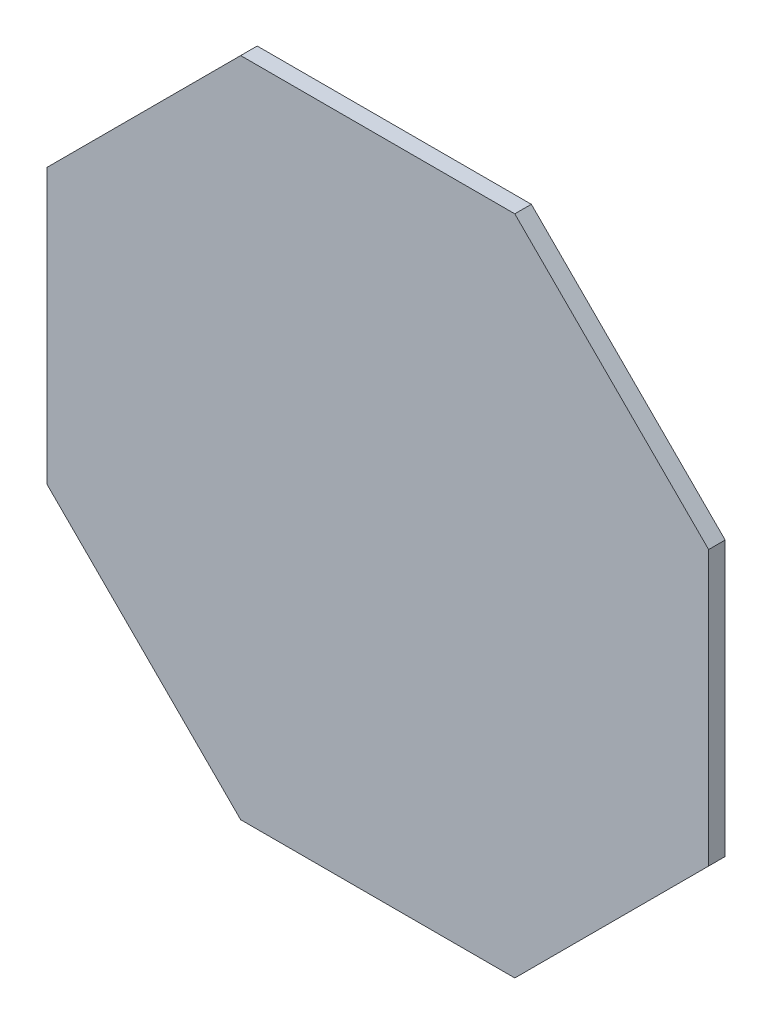
ISO-10303-21;
HEADER;
FILE_DESCRIPTION(('STEP AP214'),'2;1');
FILE_NAME('part.step','',(''),(''),'','','');
FILE_SCHEMA(('AUTOMOTIVE_DESIGN { 1 0 10303 214 1 1 1 1 }'));
ENDSEC;
DATA;
#1=APPLICATION_CONTEXT('core data for automotive mechanical design processes');
#2=APPLICATION_PROTOCOL_DEFINITION('international standard','automotive_design',2000,#1);
#3=PRODUCT_CONTEXT('',#1,'mechanical');
#4=PRODUCT('Part','Part','',(#3));
#5=PRODUCT_RELATED_PRODUCT_CATEGORY('part','',(#4));
#6=PRODUCT_DEFINITION_FORMATION('','',#4);
#7=PRODUCT_DEFINITION_CONTEXT('part definition',#1,'design');
#8=PRODUCT_DEFINITION('design','',#6,#7);
#9=PRODUCT_DEFINITION_SHAPE('','',#8);
#10=(LENGTH_UNIT() NAMED_UNIT(*) SI_UNIT(.MILLI.,.METRE.));
#11=(NAMED_UNIT(*) PLANE_ANGLE_UNIT() SI_UNIT($,.RADIAN.));
#12=(NAMED_UNIT(*) SI_UNIT($,.STERADIAN.) SOLID_ANGLE_UNIT());
#13=UNCERTAINTY_MEASURE_WITH_UNIT(LENGTH_MEASURE(1.E-05),#10,'distance_accuracy_value','');
#14=(GEOMETRIC_REPRESENTATION_CONTEXT(3) GLOBAL_UNCERTAINTY_ASSIGNED_CONTEXT((#13)) GLOBAL_UNIT_ASSIGNED_CONTEXT((#10,
#11,#12)) REPRESENTATION_CONTEXT('',''));
#15=CARTESIAN_POINT('',(0.,0.,0.));
#16=DIRECTION('',(0.,0.,1.));
#17=DIRECTION('',(1.,0.,0.));
#18=AXIS2_PLACEMENT_3D('',#15,#16,#17);
#19=CARTESIAN_POINT('',(40.,-16.5685424949238,2.));
#20=DIRECTION('',(-1.,0.,0.));
#21=DIRECTION('',(0.,0.,1.));
#22=AXIS2_PLACEMENT_3D('',#19,#20,#21);
#23=PLANE('',#22);
#24=DIRECTION('',(0.,1.,0.));
#25=VECTOR('',#24,1.);
#26=CARTESIAN_POINT('',(40.,-16.5685424949238,0.));
#27=LINE('',#26,#25);
#28=CARTESIAN_POINT('',(40.,-16.5685424949238,0.));
#29=VERTEX_POINT('',#28);
#30=CARTESIAN_POINT('',(40.,16.5685424949238,0.));
#31=VERTEX_POINT('',#30);
#32=EDGE_CURVE('E163',#29,#31,#27,.T.);
#33=ORIENTED_EDGE('',*,*,#32,.T.);
#34=DIRECTION('',(0.,0.,-1.));
#35=VECTOR('',#34,1.);
#36=CARTESIAN_POINT('',(40.,16.5685424949238,2.));
#37=LINE('',#36,#35);
#38=CARTESIAN_POINT('',(40.,16.5685424949238,2.));
#39=VERTEX_POINT('',#38);
#40=EDGE_CURVE('E206',#39,#31,#37,.T.);
#41=ORIENTED_EDGE('',*,*,#40,.F.);
#42=DIRECTION('',(0.,1.,0.));
#43=VECTOR('',#42,1.);
#44=CARTESIAN_POINT('',(40.,-16.5685424949238,2.));
#45=LINE('',#44,#43);
#46=CARTESIAN_POINT('',(40.,-16.5685424949238,2.));
#47=VERTEX_POINT('',#46);
#48=EDGE_CURVE('E157',#47,#39,#45,.T.);
#49=ORIENTED_EDGE('',*,*,#48,.F.);
#50=DIRECTION('',(0.,0.,-1.));
#51=VECTOR('',#50,1.);
#52=CARTESIAN_POINT('',(40.,-16.5685424949238,2.));
#53=LINE('',#52,#51);
#54=EDGE_CURVE('E152',#47,#29,#53,.T.);
#55=ORIENTED_EDGE('',*,*,#54,.T.);
#56=EDGE_LOOP('',(#33,#41,#49,#55));
#57=FACE_BOUND('',#56,.T.);
#58=ADVANCED_FACE('F35',(#57),#23,.F.);
#59=CARTESIAN_POINT('',(40.,16.5685424949238,2.));
#60=DIRECTION('',(-0.707106781186547,-0.707106781186548,0.));
#61=DIRECTION('',(0.707106781186548,-0.707106781186547,0.));
#62=AXIS2_PLACEMENT_3D('',#59,#60,#61);
#63=PLANE('',#62);
#64=DIRECTION('',(-0.707106781186548,0.707106781186547,0.));
#65=VECTOR('',#64,1.);
#66=CARTESIAN_POINT('',(40.,16.5685424949238,0.));
#67=LINE('',#66,#65);
#68=CARTESIAN_POINT('',(16.5685424949238,40.,0.));
#69=VERTEX_POINT('',#68);
#70=EDGE_CURVE('E169',#31,#69,#67,.T.);
#71=ORIENTED_EDGE('',*,*,#70,.T.);
#72=DIRECTION('',(0.,0.,-1.));
#73=VECTOR('',#72,1.);
#74=CARTESIAN_POINT('',(16.5685424949238,40.,2.));
#75=LINE('',#74,#73);
#76=CARTESIAN_POINT('',(16.5685424949238,40.,2.));
#77=VERTEX_POINT('',#76);
#78=EDGE_CURVE('E203',#77,#69,#75,.T.);
#79=ORIENTED_EDGE('',*,*,#78,.F.);
#80=DIRECTION('',(-0.707106781186548,0.707106781186547,0.));
#81=VECTOR('',#80,1.);
#82=CARTESIAN_POINT('',(40.,16.5685424949238,2.));
#83=LINE('',#82,#81);
#84=EDGE_CURVE('E282',#39,#77,#83,.T.);
#85=ORIENTED_EDGE('',*,*,#84,.F.);
#86=ORIENTED_EDGE('',*,*,#40,.T.);
#87=EDGE_LOOP('',(#71,#79,#85,#86));
#88=FACE_BOUND('',#87,.T.);
#89=ADVANCED_FACE('F297',(#88),#63,.F.);
#90=CARTESIAN_POINT('',(16.5685424949238,40.,2.));
#91=DIRECTION('',(0.,-1.,0.));
#92=DIRECTION('',(1.,0.,0.));
#93=AXIS2_PLACEMENT_3D('',#90,#91,#92);
#94=PLANE('',#93);
#95=DIRECTION('',(-1.,0.,0.));
#96=VECTOR('',#95,1.);
#97=CARTESIAN_POINT('',(16.5685424949238,40.,0.));
#98=LINE('',#97,#96);
#99=CARTESIAN_POINT('',(-16.5685424949238,40.,0.));
#100=VERTEX_POINT('',#99);
#101=EDGE_CURVE('E173',#69,#100,#98,.T.);
#102=ORIENTED_EDGE('',*,*,#101,.T.);
#103=DIRECTION('',(0.,0.,-1.));
#104=VECTOR('',#103,1.);
#105=CARTESIAN_POINT('',(-16.5685424949238,40.,2.));
#106=LINE('',#105,#104);
#107=CARTESIAN_POINT('',(-16.5685424949238,40.,2.));
#108=VERTEX_POINT('',#107);
#109=EDGE_CURVE('E200',#108,#100,#106,.T.);
#110=ORIENTED_EDGE('',*,*,#109,.F.);
#111=DIRECTION('',(-1.,0.,0.));
#112=VECTOR('',#111,1.);
#113=CARTESIAN_POINT('',(16.5685424949238,40.,2.));
#114=LINE('',#113,#112);
#115=EDGE_CURVE('E284',#77,#108,#114,.T.);
#116=ORIENTED_EDGE('',*,*,#115,.F.);
#117=ORIENTED_EDGE('',*,*,#78,.T.);
#118=EDGE_LOOP('',(#102,#110,#116,#117));
#119=FACE_BOUND('',#118,.T.);
#120=ADVANCED_FACE('F301',(#119),#94,.F.);
#121=CARTESIAN_POINT('',(-16.5685424949238,40.,2.));
#122=DIRECTION('',(0.707106781186548,-0.707106781186547,0.));
#123=DIRECTION('',(0.707106781186547,0.707106781186548,0.));
#124=AXIS2_PLACEMENT_3D('',#121,#122,#123);
#125=PLANE('',#124);
#126=DIRECTION('',(-0.707106781186547,-0.707106781186548,0.));
#127=VECTOR('',#126,1.);
#128=CARTESIAN_POINT('',(-16.5685424949238,40.,0.));
#129=LINE('',#128,#127);
#130=CARTESIAN_POINT('',(-40.,16.5685424949238,0.));
#131=VERTEX_POINT('',#130);
#132=EDGE_CURVE('E182',#100,#131,#129,.T.);
#133=ORIENTED_EDGE('',*,*,#132,.T.);
#134=DIRECTION('',(0.,0.,-1.));
#135=VECTOR('',#134,1.);
#136=CARTESIAN_POINT('',(-40.,16.5685424949238,2.));
#137=LINE('',#136,#135);
#138=CARTESIAN_POINT('',(-40.,16.5685424949238,2.));
#139=VERTEX_POINT('',#138);
#140=EDGE_CURVE('E197',#139,#131,#137,.T.);
#141=ORIENTED_EDGE('',*,*,#140,.F.);
#142=DIRECTION('',(-0.707106781186547,-0.707106781186548,0.));
#143=VECTOR('',#142,1.);
#144=CARTESIAN_POINT('',(-16.5685424949238,40.,2.));
#145=LINE('',#144,#143);
#146=EDGE_CURVE('E286',#108,#139,#145,.T.);
#147=ORIENTED_EDGE('',*,*,#146,.F.);
#148=ORIENTED_EDGE('',*,*,#109,.T.);
#149=EDGE_LOOP('',(#133,#141,#147,#148));
#150=FACE_BOUND('',#149,.T.);
#151=ADVANCED_FACE('F307',(#150),#125,.F.);
#152=CARTESIAN_POINT('',(-40.,16.5685424949238,2.));
#153=DIRECTION('',(1.,0.,0.));
#154=DIRECTION('',(0.,0.,-1.));
#155=AXIS2_PLACEMENT_3D('',#152,#153,#154);
#156=PLANE('',#155);
#157=DIRECTION('',(0.,-1.,0.));
#158=VECTOR('',#157,1.);
#159=CARTESIAN_POINT('',(-40.,16.5685424949238,0.));
#160=LINE('',#159,#158);
#161=CARTESIAN_POINT('',(-40.,-16.5685424949238,0.));
#162=VERTEX_POINT('',#161);
#163=EDGE_CURVE('E184',#131,#162,#160,.T.);
#164=ORIENTED_EDGE('',*,*,#163,.T.);
#165=DIRECTION('',(0.,0.,-1.));
#166=VECTOR('',#165,1.);
#167=CARTESIAN_POINT('',(-40.,-16.5685424949238,2.));
#168=LINE('',#167,#166);
#169=CARTESIAN_POINT('',(-40.,-16.5685424949238,2.));
#170=VERTEX_POINT('',#169);
#171=EDGE_CURVE('E194',#170,#162,#168,.T.);
#172=ORIENTED_EDGE('',*,*,#171,.F.);
#173=DIRECTION('',(0.,-1.,0.));
#174=VECTOR('',#173,1.);
#175=CARTESIAN_POINT('',(-40.,16.5685424949238,2.));
#176=LINE('',#175,#174);
#177=EDGE_CURVE('E288',#139,#170,#176,.T.);
#178=ORIENTED_EDGE('',*,*,#177,.F.);
#179=ORIENTED_EDGE('',*,*,#140,.T.);
#180=EDGE_LOOP('',(#164,#172,#178,#179));
#181=FACE_BOUND('',#180,.T.);
#182=ADVANCED_FACE('F311',(#181),#156,.F.);
#183=CARTESIAN_POINT('',(-40.,-16.5685424949238,2.));
#184=DIRECTION('',(0.707106781186547,0.707106781186548,0.));
#185=DIRECTION('',(-0.707106781186548,0.707106781186547,0.));
#186=AXIS2_PLACEMENT_3D('',#183,#184,#185);
#187=PLANE('',#186);
#188=DIRECTION('',(0.707106781186548,-0.707106781186547,0.));
#189=VECTOR('',#188,1.);
#190=CARTESIAN_POINT('',(-40.,-16.5685424949238,0.));
#191=LINE('',#190,#189);
#192=CARTESIAN_POINT('',(-16.5685424949238,-40.,0.));
#193=VERTEX_POINT('',#192);
#194=EDGE_CURVE('E186',#162,#193,#191,.T.);
#195=ORIENTED_EDGE('',*,*,#194,.T.);
#196=DIRECTION('',(0.,0.,-1.));
#197=VECTOR('',#196,1.);
#198=CARTESIAN_POINT('',(-16.5685424949238,-40.,2.));
#199=LINE('',#198,#197);
#200=CARTESIAN_POINT('',(-16.5685424949238,-40.,2.));
#201=VERTEX_POINT('',#200);
#202=EDGE_CURVE('E191',#201,#193,#199,.T.);
#203=ORIENTED_EDGE('',*,*,#202,.F.);
#204=DIRECTION('',(0.707106781186548,-0.707106781186547,0.));
#205=VECTOR('',#204,1.);
#206=CARTESIAN_POINT('',(-40.,-16.5685424949238,2.));
#207=LINE('',#206,#205);
#208=EDGE_CURVE('E290',#170,#201,#207,.T.);
#209=ORIENTED_EDGE('',*,*,#208,.F.);
#210=ORIENTED_EDGE('',*,*,#171,.T.);
#211=EDGE_LOOP('',(#195,#203,#209,#210));
#212=FACE_BOUND('',#211,.T.);
#213=ADVANCED_FACE('F316',(#212),#187,.F.);
#214=CARTESIAN_POINT('',(-16.5685424949238,-40.,2.));
#215=DIRECTION('',(0.,1.,0.));
#216=DIRECTION('',(-1.,0.,0.));
#217=AXIS2_PLACEMENT_3D('',#214,#215,#216);
#218=PLANE('',#217);
#219=DIRECTION('',(0.,0.,1.));
#220=VECTOR('',#219,1.);
#221=CARTESIAN_POINT('',(7.20000000000002,-40.,1.9));
#222=LINE('',#221,#220);
#223=CARTESIAN_POINT('',(7.20000000000002,-40.,-6.5));
#224=VERTEX_POINT('',#223);
#225=CARTESIAN_POINT('',(7.20000000000002,-40.,0.));
#226=VERTEX_POINT('',#225);
#227=EDGE_CURVE('E54',#224,#226,#222,.T.);
#228=ORIENTED_EDGE('',*,*,#227,.T.);
#229=DIRECTION('',(1.,0.,0.));
#230=VECTOR('',#229,1.);
#231=CARTESIAN_POINT('',(-16.5685424949238,-40.,0.));
#232=LINE('',#231,#230);
#233=CARTESIAN_POINT('',(16.5685424949238,-40.,0.));
#234=VERTEX_POINT('',#233);
#235=EDGE_CURVE('E142',#226,#234,#232,.T.);
#236=ORIENTED_EDGE('',*,*,#235,.T.);
#237=DIRECTION('',(0.,0.,-1.));
#238=VECTOR('',#237,1.);
#239=CARTESIAN_POINT('',(16.5685424949238,-40.,2.));
#240=LINE('',#239,#238);
#241=CARTESIAN_POINT('',(16.5685424949238,-40.,2.));
#242=VERTEX_POINT('',#241);
#243=EDGE_CURVE('E154',#242,#234,#240,.T.);
#244=ORIENTED_EDGE('',*,*,#243,.F.);
#245=DIRECTION('',(1.,0.,0.));
#246=VECTOR('',#245,1.);
#247=CARTESIAN_POINT('',(-16.5685424949238,-40.,2.));
#248=LINE('',#247,#246);
#249=EDGE_CURVE('E291',#201,#242,#248,.T.);
#250=ORIENTED_EDGE('',*,*,#249,.F.);
#251=ORIENTED_EDGE('',*,*,#202,.T.);
#252=CARTESIAN_POINT('',(-7.19999999999998,-40.,0.));
#253=VERTEX_POINT('',#252);
#254=EDGE_CURVE('E158',#193,#253,#232,.T.);
#255=ORIENTED_EDGE('',*,*,#254,.T.);
#256=DIRECTION('',(0.,0.,-1.));
#257=VECTOR('',#256,1.);
#258=CARTESIAN_POINT('',(-7.19999999999998,-40.,1.9));
#259=LINE('',#258,#257);
#260=CARTESIAN_POINT('',(-7.19999999999998,-40.,-6.5));
#261=VERTEX_POINT('',#260);
#262=EDGE_CURVE('E257',#253,#261,#259,.T.);
#263=ORIENTED_EDGE('',*,*,#262,.T.);
#264=DIRECTION('',(1.,0.,0.));
#265=VECTOR('',#264,1.);
#266=CARTESIAN_POINT('',(7.20000000000002,-40.,-6.5));
#267=LINE('',#266,#265);
#268=EDGE_CURVE('E264',#261,#224,#267,.T.);
#269=ORIENTED_EDGE('',*,*,#268,.T.);
#270=EDGE_LOOP('',(#228,#236,#244,#250,#251,#255,#263,#269));
#271=FACE_BOUND('',#270,.T.);
#272=DIRECTION('',(1.,0.,0.));
#273=VECTOR('',#272,1.);
#274=CARTESIAN_POINT('',(5.20000000000002,-40.,-4.5));
#275=LINE('',#274,#273);
#276=CARTESIAN_POINT('',(-5.19999999999999,-40.,-4.5));
#277=VERTEX_POINT('',#276);
#278=CARTESIAN_POINT('',(5.20000000000002,-40.,-4.5));
#279=VERTEX_POINT('',#278);
#280=EDGE_CURVE('E250',#277,#279,#275,.T.);
#281=ORIENTED_EDGE('',*,*,#280,.F.);
#282=DIRECTION('',(0.,0.,-1.));
#283=VECTOR('',#282,1.);
#284=CARTESIAN_POINT('',(-5.19999999999998,-40.,-0.1));
#285=LINE('',#284,#283);
#286=CARTESIAN_POINT('',(-5.19999999999998,-40.,-0.1));
#287=VERTEX_POINT('',#286);
#288=EDGE_CURVE('E88',#287,#277,#285,.T.);
#289=ORIENTED_EDGE('',*,*,#288,.F.);
#290=DIRECTION('',(-1.,0.,0.));
#291=VECTOR('',#290,1.);
#292=CARTESIAN_POINT('',(5.20000000000002,-40.,-0.1));
#293=LINE('',#292,#291);
#294=CARTESIAN_POINT('',(5.20000000000002,-40.,-0.1));
#295=VERTEX_POINT('',#294);
#296=EDGE_CURVE('E228',#295,#287,#293,.T.);
#297=ORIENTED_EDGE('',*,*,#296,.F.);
#298=DIRECTION('',(0.,0.,1.));
#299=VECTOR('',#298,1.);
#300=CARTESIAN_POINT('',(5.20000000000002,-40.,-0.1));
#301=LINE('',#300,#299);
#302=EDGE_CURVE('E238',#279,#295,#301,.T.);
#303=ORIENTED_EDGE('',*,*,#302,.F.);
#304=EDGE_LOOP('',(#281,#289,#297,#303));
#305=FACE_BOUND('',#304,.T.);
#306=ADVANCED_FACE('F272',(#271,#305),#218,.F.);
#307=CARTESIAN_POINT('',(16.5685424949238,-40.,2.));
#308=DIRECTION('',(-0.707106781186548,0.707106781186547,0.));
#309=DIRECTION('',(-0.707106781186547,-0.707106781186548,0.));
#310=AXIS2_PLACEMENT_3D('',#307,#308,#309);
#311=PLANE('',#310);
#312=DIRECTION('',(0.707106781186547,0.707106781186548,0.));
#313=VECTOR('',#312,1.);
#314=CARTESIAN_POINT('',(16.5685424949238,-40.,0.));
#315=LINE('',#314,#313);
#316=EDGE_CURVE('E148',#234,#29,#315,.T.);
#317=ORIENTED_EDGE('',*,*,#316,.T.);
#318=ORIENTED_EDGE('',*,*,#54,.F.);
#319=DIRECTION('',(0.707106781186547,0.707106781186548,0.));
#320=VECTOR('',#319,1.);
#321=CARTESIAN_POINT('',(16.5685424949238,-40.,2.));
#322=LINE('',#321,#320);
#323=EDGE_CURVE('E165',#242,#47,#322,.T.);
#324=ORIENTED_EDGE('',*,*,#323,.F.);
#325=ORIENTED_EDGE('',*,*,#243,.T.);
#326=EDGE_LOOP('',(#317,#318,#324,#325));
#327=FACE_BOUND('',#326,.T.);
#328=ADVANCED_FACE('F150',(#327),#311,.F.);
#329=CARTESIAN_POINT('',(0.,0.,2.));
#330=DIRECTION('',(0.,0.,1.));
#331=DIRECTION('',(1.,0.,0.));
#332=AXIS2_PLACEMENT_3D('',#329,#330,#331);
#333=PLANE('',#332);
#334=ORIENTED_EDGE('',*,*,#48,.T.);
#335=ORIENTED_EDGE('',*,*,#84,.T.);
#336=ORIENTED_EDGE('',*,*,#115,.T.);
#337=ORIENTED_EDGE('',*,*,#146,.T.);
#338=ORIENTED_EDGE('',*,*,#177,.T.);
#339=ORIENTED_EDGE('',*,*,#208,.T.);
#340=ORIENTED_EDGE('',*,*,#249,.T.);
#341=ORIENTED_EDGE('',*,*,#323,.T.);
#342=EDGE_LOOP('',(#334,#335,#336,#337,#338,#339,#340,#341));
#343=FACE_BOUND('',#342,.T.);
#344=ADVANCED_FACE('F294',(#343),#333,.T.);
#345=CARTESIAN_POINT('',(0.,0.,0.));
#346=DIRECTION('',(0.,0.,1.));
#347=DIRECTION('',(1.,0.,0.));
#348=AXIS2_PLACEMENT_3D('',#345,#346,#347);
#349=PLANE('',#348);
#350=ORIENTED_EDGE('',*,*,#235,.F.);
#351=DIRECTION('',(0.,1.,0.));
#352=VECTOR('',#351,1.);
#353=CARTESIAN_POINT('',(7.2,0.,0.));
#354=LINE('',#353,#352);
#355=CARTESIAN_POINT('',(7.20000000000001,-25.,0.));
#356=VERTEX_POINT('',#355);
#357=EDGE_CURVE('E11',#226,#356,#354,.T.);
#358=ORIENTED_EDGE('',*,*,#357,.T.);
#359=DIRECTION('',(-1.,0.,0.));
#360=VECTOR('',#359,1.);
#361=CARTESIAN_POINT('',(0.,-25.,0.));
#362=LINE('',#361,#360);
#363=CARTESIAN_POINT('',(-7.19999999999999,-25.,0.));
#364=VERTEX_POINT('',#363);
#365=EDGE_CURVE('E208',#356,#364,#362,.T.);
#366=ORIENTED_EDGE('',*,*,#365,.T.);
#367=DIRECTION('',(0.,-1.,0.));
#368=VECTOR('',#367,1.);
#369=CARTESIAN_POINT('',(-7.19999999999999,0.,0.));
#370=LINE('',#369,#368);
#371=EDGE_CURVE('E45',#364,#253,#370,.T.);
#372=ORIENTED_EDGE('',*,*,#371,.T.);
#373=ORIENTED_EDGE('',*,*,#254,.F.);
#374=ORIENTED_EDGE('',*,*,#194,.F.);
#375=ORIENTED_EDGE('',*,*,#163,.F.);
#376=ORIENTED_EDGE('',*,*,#132,.F.);
#377=ORIENTED_EDGE('',*,*,#101,.F.);
#378=ORIENTED_EDGE('',*,*,#70,.F.);
#379=ORIENTED_EDGE('',*,*,#32,.F.);
#380=ORIENTED_EDGE('',*,*,#316,.F.);
#381=EDGE_LOOP('',(#350,#358,#366,#372,#373,#374,#375,#376,#377,#378,#379,#380));
#382=FACE_BOUND('',#381,.T.);
#383=ADVANCED_FACE('F167',(#382),#349,.F.);
#384=CARTESIAN_POINT('',(7.20000000000001,-25.,1.9));
#385=DIRECTION('',(1.,0.,0.));
#386=DIRECTION('',(0.,1.,0.));
#387=AXIS2_PLACEMENT_3D('',#384,#385,#386);
#388=PLANE('',#387);
#389=ORIENTED_EDGE('',*,*,#357,.F.);
#390=ORIENTED_EDGE('',*,*,#227,.F.);
#391=DIRECTION('',(0.,-1.,0.));
#392=VECTOR('',#391,1.);
#393=CARTESIAN_POINT('',(7.20000000000001,-25.,-6.5));
#394=LINE('',#393,#392);
#395=CARTESIAN_POINT('',(7.20000000000001,-25.,-6.5));
#396=VERTEX_POINT('',#395);
#397=EDGE_CURVE('E171',#396,#224,#394,.T.);
#398=ORIENTED_EDGE('',*,*,#397,.F.);
#399=DIRECTION('',(0.,0.,1.));
#400=VECTOR('',#399,1.);
#401=CARTESIAN_POINT('',(7.20000000000001,-25.,1.9));
#402=LINE('',#401,#400);
#403=EDGE_CURVE('E274',#396,#356,#402,.T.);
#404=ORIENTED_EDGE('',*,*,#403,.T.);
#405=EDGE_LOOP('',(#389,#390,#398,#404));
#406=FACE_BOUND('',#405,.T.);
#407=ADVANCED_FACE('F270',(#406),#388,.T.);
#408=CARTESIAN_POINT('',(-7.19999999999999,-25.,1.9));
#409=DIRECTION('',(-1.,0.,0.));
#410=DIRECTION('',(0.,-1.,0.));
#411=AXIS2_PLACEMENT_3D('',#408,#409,#410);
#412=PLANE('',#411);
#413=ORIENTED_EDGE('',*,*,#371,.F.);
#414=DIRECTION('',(0.,0.,-1.));
#415=VECTOR('',#414,1.);
#416=CARTESIAN_POINT('',(-7.19999999999999,-25.,1.9));
#417=LINE('',#416,#415);
#418=CARTESIAN_POINT('',(-7.19999999999999,-25.,-6.5));
#419=VERTEX_POINT('',#418);
#420=EDGE_CURVE('E276',#364,#419,#417,.T.);
#421=ORIENTED_EDGE('',*,*,#420,.T.);
#422=DIRECTION('',(0.,-1.,0.));
#423=VECTOR('',#422,1.);
#424=CARTESIAN_POINT('',(-7.19999999999999,-25.,-6.5));
#425=LINE('',#424,#423);
#426=EDGE_CURVE('E176',#419,#261,#425,.T.);
#427=ORIENTED_EDGE('',*,*,#426,.T.);
#428=ORIENTED_EDGE('',*,*,#262,.F.);
#429=EDGE_LOOP('',(#413,#421,#427,#428));
#430=FACE_BOUND('',#429,.T.);
#431=ADVANCED_FACE('F320',(#430),#412,.T.);
#432=CARTESIAN_POINT('',(0.,-25.,0.));
#433=DIRECTION('',(0.,1.,0.));
#434=DIRECTION('',(0.,0.,1.));
#435=AXIS2_PLACEMENT_3D('',#432,#433,#434);
#436=PLANE('',#435);
#437=DIRECTION('',(0.,0.,1.));
#438=VECTOR('',#437,1.);
#439=CARTESIAN_POINT('',(-4.67618845762377,-25.,-0.1));
#440=LINE('',#439,#438);
#441=CARTESIAN_POINT('',(-4.67618845762377,-25.,-0.623811542376217));
#442=VERTEX_POINT('',#441);
#443=CARTESIAN_POINT('',(-4.67618845762377,-25.,-3.97618845762378));
#444=VERTEX_POINT('',#443);
#445=EDGE_CURVE('E225',#442,#444,#440,.F.);
#446=ORIENTED_EDGE('',*,*,#445,.T.);
#447=DIRECTION('',(-1.,0.,0.));
#448=VECTOR('',#447,1.);
#449=CARTESIAN_POINT('',(5.20000000000002,-25.,-3.97618845762378));
#450=LINE('',#449,#448);
#451=CARTESIAN_POINT('',(4.67618845762379,-25.,-3.97618845762378));
#452=VERTEX_POINT('',#451);
#453=EDGE_CURVE('E227',#444,#452,#450,.F.);
#454=ORIENTED_EDGE('',*,*,#453,.T.);
#455=DIRECTION('',(0.,0.,-1.));
#456=VECTOR('',#455,1.);
#457=CARTESIAN_POINT('',(4.67618845762379,-25.,-0.1));
#458=LINE('',#457,#456);
#459=CARTESIAN_POINT('',(4.67618845762379,-25.,-0.623811542376217));
#460=VERTEX_POINT('',#459);
#461=EDGE_CURVE('E39',#452,#460,#458,.F.);
#462=ORIENTED_EDGE('',*,*,#461,.T.);
#463=DIRECTION('',(1.,0.,0.));
#464=VECTOR('',#463,1.);
#465=CARTESIAN_POINT('',(5.20000000000002,-25.,-0.623811542376217));
#466=LINE('',#465,#464);
#467=EDGE_CURVE('E221',#460,#442,#466,.F.);
#468=ORIENTED_EDGE('',*,*,#467,.T.);
#469=EDGE_LOOP('',(#446,#454,#462,#468));
#470=FACE_BOUND('',#469,.T.);
#471=ORIENTED_EDGE('',*,*,#365,.F.);
#472=ORIENTED_EDGE('',*,*,#403,.F.);
#473=DIRECTION('',(1.,0.,0.));
#474=VECTOR('',#473,1.);
#475=CARTESIAN_POINT('',(7.20000000000001,-25.,-6.5));
#476=LINE('',#475,#474);
#477=EDGE_CURVE('E266',#419,#396,#476,.T.);
#478=ORIENTED_EDGE('',*,*,#477,.F.);
#479=ORIENTED_EDGE('',*,*,#420,.F.);
#480=EDGE_LOOP('',(#471,#472,#478,#479));
#481=FACE_BOUND('',#480,.T.);
#482=ADVANCED_FACE('F232',(#470,#481),#436,.T.);
#483=CARTESIAN_POINT('',(7.20000000000001,-25.,-6.5));
#484=DIRECTION('',(0.,0.,-1.));
#485=DIRECTION('',(-1.,0.,0.));
#486=AXIS2_PLACEMENT_3D('',#483,#484,#485);
#487=PLANE('',#486);
#488=ORIENTED_EDGE('',*,*,#268,.F.);
#489=ORIENTED_EDGE('',*,*,#426,.F.);
#490=ORIENTED_EDGE('',*,*,#477,.T.);
#491=ORIENTED_EDGE('',*,*,#397,.T.);
#492=EDGE_LOOP('',(#488,#489,#490,#491));
#493=FACE_BOUND('',#492,.T.);
#494=ADVANCED_FACE('F262',(#493),#487,.T.);
#495=CARTESIAN_POINT('',(-5.19999999999998,-40.,-0.1));
#496=DIRECTION('',(0.999390827019096,-0.0348994967025006,0.));
#497=DIRECTION('',(0.0348994967025006,0.999390827019096,0.));
#498=AXIS2_PLACEMENT_3D('',#495,#496,#497);
#499=PLANE('',#498);
#500=ORIENTED_EDGE('',*,*,#288,.T.);
#501=DIRECTION('',(-0.0348782627423743,-0.998782765958718,-0.0348782627423747));
#502=VECTOR('',#501,1.);
#503=CARTESIAN_POINT('',(-5.19464742986751,-39.8467224459719,-4.49464742986752));
#504=LINE('',#503,#502);
#505=EDGE_CURVE('E219',#444,#277,#504,.T.);
#506=ORIENTED_EDGE('',*,*,#505,.F.);
#507=ORIENTED_EDGE('',*,*,#445,.F.);
#508=DIRECTION('',(-0.0348782627423743,-0.998782765958718,0.0348782627423747));
#509=VECTOR('',#508,1.);
#510=CARTESIAN_POINT('',(-5.18734847059595,-39.6377075995699,-0.112651529404032));
#511=LINE('',#510,#509);
#512=EDGE_CURVE('E213',#442,#287,#511,.T.);
#513=ORIENTED_EDGE('',*,*,#512,.T.);
#514=EDGE_LOOP('',(#500,#506,#507,#513));
#515=FACE_BOUND('',#514,.T.);
#516=ADVANCED_FACE('F244',(#515),#499,.T.);
#517=CARTESIAN_POINT('',(5.20000000000002,-40.,-0.1));
#518=DIRECTION('',(0.,-0.034899496702501,-0.999390827019096));
#519=DIRECTION('',(0.,0.999390827019096,-0.034899496702501));
#520=AXIS2_PLACEMENT_3D('',#517,#518,#519);
#521=PLANE('',#520);
#522=ORIENTED_EDGE('',*,*,#296,.T.);
#523=ORIENTED_EDGE('',*,*,#512,.F.);
#524=ORIENTED_EDGE('',*,*,#467,.F.);
#525=DIRECTION('',(0.0348782627423751,-0.998782765958718,0.0348782627423747));
#526=VECTOR('',#525,1.);
#527=CARTESIAN_POINT('',(5.20000000000002,-40.,-0.1));
#528=LINE('',#527,#526);
#529=EDGE_CURVE('E215',#460,#295,#528,.T.);
#530=ORIENTED_EDGE('',*,*,#529,.T.);
#531=EDGE_LOOP('',(#522,#523,#524,#530));
#532=FACE_BOUND('',#531,.T.);
#533=ADVANCED_FACE('F242',(#532),#521,.T.);
#534=CARTESIAN_POINT('',(5.20000000000002,-40.,-0.1));
#535=DIRECTION('',(-0.999390827019096,-0.0348994967025015,0.));
#536=DIRECTION('',(0.0348994967025015,-0.999390827019096,0.));
#537=AXIS2_PLACEMENT_3D('',#534,#535,#536);
#538=PLANE('',#537);
#539=ORIENTED_EDGE('',*,*,#302,.T.);
#540=ORIENTED_EDGE('',*,*,#529,.F.);
#541=ORIENTED_EDGE('',*,*,#461,.F.);
#542=DIRECTION('',(0.0348782627423751,-0.998782765958718,-0.0348782627423747));
#543=VECTOR('',#542,1.);
#544=CARTESIAN_POINT('',(5.20000000000002,-40.,-4.5));
#545=LINE('',#544,#543);
#546=EDGE_CURVE('E218',#452,#279,#545,.T.);
#547=ORIENTED_EDGE('',*,*,#546,.T.);
#548=EDGE_LOOP('',(#539,#540,#541,#547));
#549=FACE_BOUND('',#548,.T.);
#550=ADVANCED_FACE('F37',(#549),#538,.T.);
#551=CARTESIAN_POINT('',(5.20000000000002,-40.,-4.5));
#552=DIRECTION('',(0.,-0.034899496702501,0.999390827019096));
#553=DIRECTION('',(0.,-0.999390827019096,-0.034899496702501));
#554=AXIS2_PLACEMENT_3D('',#551,#552,#553);
#555=PLANE('',#554);
#556=ORIENTED_EDGE('',*,*,#280,.T.);
#557=ORIENTED_EDGE('',*,*,#546,.F.);
#558=ORIENTED_EDGE('',*,*,#453,.F.);
#559=ORIENTED_EDGE('',*,*,#505,.T.);
#560=EDGE_LOOP('',(#556,#557,#558,#559));
#561=FACE_BOUND('',#560,.T.);
#562=ADVANCED_FACE('F248',(#561),#555,.T.);
#563=CLOSED_SHELL('',(#58,#89,#120,#151,#182,#213,#306,#328,#344,#383,#407,#431,#482,#494,#516,
#533,#550,#562));
#564=MANIFOLD_SOLID_BREP('B2',#563);
#565=ADVANCED_BREP_SHAPE_REPRESENTATION('',(#18,#564),#14);
#566=SHAPE_DEFINITION_REPRESENTATION(#9,#565);
ENDSEC;
END-ISO-10303-21;
